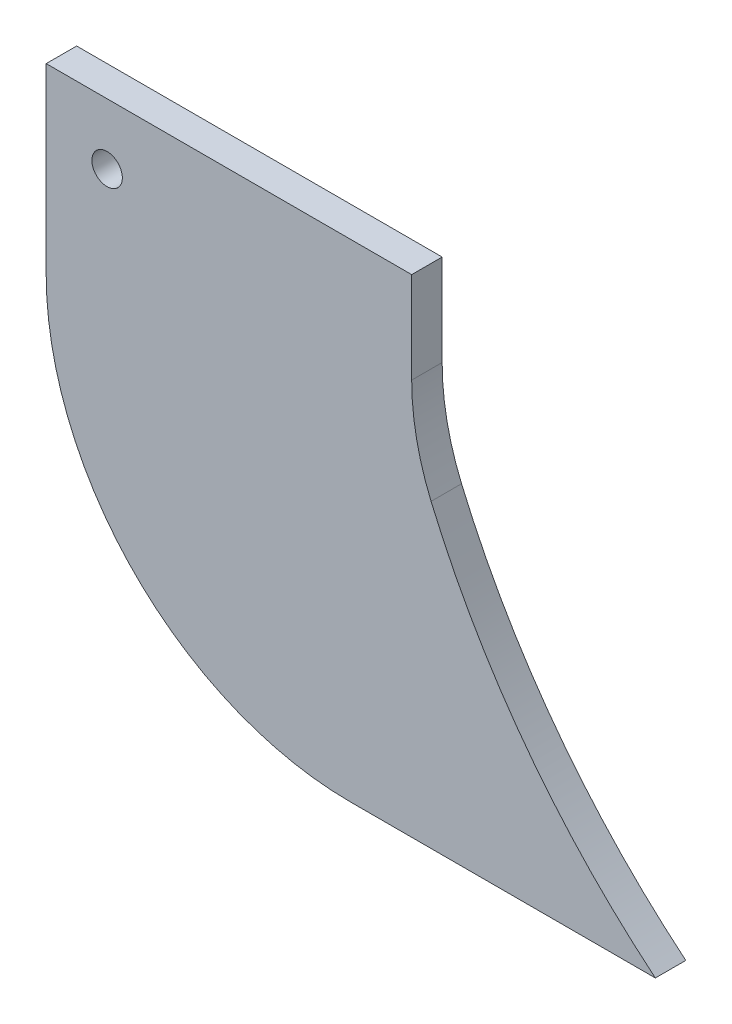
ISO-10303-21;
HEADER;
FILE_DESCRIPTION(('STEP AP214'),'2;1');
FILE_NAME('part.step','',(''),(''),'','','');
FILE_SCHEMA(('AUTOMOTIVE_DESIGN { 1 0 10303 214 1 1 1 1 }'));
ENDSEC;
DATA;
#1=APPLICATION_CONTEXT('core data for automotive mechanical design processes');
#2=APPLICATION_PROTOCOL_DEFINITION('international standard','automotive_design',2000,#1);
#3=PRODUCT_CONTEXT('',#1,'mechanical');
#4=PRODUCT('Part','Part','',(#3));
#5=PRODUCT_RELATED_PRODUCT_CATEGORY('part','',(#4));
#6=PRODUCT_DEFINITION_FORMATION('','',#4);
#7=PRODUCT_DEFINITION_CONTEXT('part definition',#1,'design');
#8=PRODUCT_DEFINITION('design','',#6,#7);
#9=PRODUCT_DEFINITION_SHAPE('','',#8);
#10=(LENGTH_UNIT() NAMED_UNIT(*) SI_UNIT(.MILLI.,.METRE.));
#11=(NAMED_UNIT(*) PLANE_ANGLE_UNIT() SI_UNIT($,.RADIAN.));
#12=(NAMED_UNIT(*) SI_UNIT($,.STERADIAN.) SOLID_ANGLE_UNIT());
#13=UNCERTAINTY_MEASURE_WITH_UNIT(LENGTH_MEASURE(1.E-05),#10,'distance_accuracy_value','');
#14=(GEOMETRIC_REPRESENTATION_CONTEXT(3) GLOBAL_UNCERTAINTY_ASSIGNED_CONTEXT((#13)) GLOBAL_UNIT_ASSIGNED_CONTEXT((#10,
#11,#12)) REPRESENTATION_CONTEXT('',''));
#15=CARTESIAN_POINT('',(0.,0.,0.));
#16=DIRECTION('',(0.,0.,1.));
#17=DIRECTION('',(1.,0.,0.));
#18=AXIS2_PLACEMENT_3D('',#15,#16,#17);
#19=CARTESIAN_POINT('',(232.199409389724,127.244230769231,6.35));
#20=DIRECTION('',(0.,0.,1.));
#21=DIRECTION('',(1.,0.,0.));
#22=AXIS2_PLACEMENT_3D('',#19,#20,#21);
#23=PLANE('',#22);
#24=CARTESIAN_POINT('',(232.199409389724,127.244230769231,6.35));
#25=DIRECTION('',(0.,0.,-1.));
#26=DIRECTION('',(1.,0.,0.));
#27=AXIS2_PLACEMENT_3D('',#24,#25,#26);
#28=CIRCLE('',#27,165.1);
#29=CARTESIAN_POINT('',(127.,0.,6.35));
#30=VERTEX_POINT('',#29);
#31=CARTESIAN_POINT('',(80.2447069379004,62.6858974358974,6.35));
#32=VERTEX_POINT('',#31);
#33=EDGE_CURVE('E155',#30,#32,#28,.T.);
#34=ORIENTED_EDGE('',*,*,#33,.T.);
#35=CARTESIAN_POINT('',(127.,82.55,6.35));
#36=DIRECTION('',(0.,0.,-1.));
#37=DIRECTION('',(1.,0.,0.));
#38=AXIS2_PLACEMENT_3D('',#35,#36,#37);
#39=CIRCLE('',#38,50.8);
#40=CARTESIAN_POINT('',(76.2,82.55,6.35));
#41=VERTEX_POINT('',#40);
#42=EDGE_CURVE('E97',#32,#41,#39,.T.);
#43=ORIENTED_EDGE('',*,*,#42,.T.);
#44=DIRECTION('',(0.,1.,0.));
#45=VECTOR('',#44,1.);
#46=CARTESIAN_POINT('',(76.2,101.6,6.35));
#47=LINE('',#46,#45);
#48=CARTESIAN_POINT('',(76.2,101.6,6.35));
#49=VERTEX_POINT('',#48);
#50=EDGE_CURVE('E172',#41,#49,#47,.T.);
#51=ORIENTED_EDGE('',*,*,#50,.T.);
#52=DIRECTION('',(-1.,0.,0.));
#53=VECTOR('',#52,1.);
#54=CARTESIAN_POINT('',(0.,101.6,6.35));
#55=LINE('',#54,#53);
#56=CARTESIAN_POINT('',(0.,101.6,6.35));
#57=VERTEX_POINT('',#56);
#58=EDGE_CURVE('E113',#49,#57,#55,.T.);
#59=ORIENTED_EDGE('',*,*,#58,.T.);
#60=DIRECTION('',(0.,-1.,0.));
#61=VECTOR('',#60,1.);
#62=CARTESIAN_POINT('',(0.,63.5000000000005,6.35));
#63=LINE('',#62,#61);
#64=CARTESIAN_POINT('',(0.,63.5,6.35));
#65=VERTEX_POINT('',#64);
#66=EDGE_CURVE('E107',#57,#65,#63,.T.);
#67=ORIENTED_EDGE('',*,*,#66,.T.);
#68=CARTESIAN_POINT('',(63.5,63.5,6.35));
#69=DIRECTION('',(0.,0.,1.));
#70=DIRECTION('',(-1.,0.,0.));
#71=AXIS2_PLACEMENT_3D('',#68,#69,#70);
#72=CIRCLE('',#71,63.5);
#73=CARTESIAN_POINT('',(63.5000000000005,0.,6.35));
#74=VERTEX_POINT('',#73);
#75=EDGE_CURVE('E111',#65,#74,#72,.T.);
#76=ORIENTED_EDGE('',*,*,#75,.T.);
#77=DIRECTION('',(1.,0.,0.));
#78=VECTOR('',#77,1.);
#79=CARTESIAN_POINT('',(63.5000000000005,0.,6.35));
#80=LINE('',#79,#78);
#81=EDGE_CURVE('E57',#74,#30,#80,.T.);
#82=ORIENTED_EDGE('',*,*,#81,.T.);
#83=EDGE_LOOP('',(#34,#43,#51,#59,#67,#76,#82));
#84=FACE_BOUND('',#83,.T.);
#85=CARTESIAN_POINT('',(12.7,88.9,6.35));
#86=DIRECTION('',(0.,0.,1.));
#87=DIRECTION('',(1.,0.,0.));
#88=AXIS2_PLACEMENT_3D('',#85,#86,#87);
#89=CIRCLE('',#88,3.175);
#90=CARTESIAN_POINT('',(15.875,88.9,6.35));
#91=VERTEX_POINT('',#90);
#92=EDGE_CURVE('E140',#91,#91,#89,.T.);
#93=ORIENTED_EDGE('',*,*,#92,.F.);
#94=EDGE_LOOP('',(#93));
#95=FACE_BOUND('',#94,.T.);
#96=ADVANCED_FACE('F39',(#84,#95),#23,.T.);
#97=CARTESIAN_POINT('',(232.199409389724,127.244230769231,0.));
#98=DIRECTION('',(0.,0.,1.));
#99=DIRECTION('',(1.,0.,0.));
#100=AXIS2_PLACEMENT_3D('',#97,#98,#99);
#101=PLANE('',#100);
#102=CARTESIAN_POINT('',(232.199409389724,127.244230769231,0.));
#103=DIRECTION('',(0.,0.,-1.));
#104=DIRECTION('',(1.,0.,0.));
#105=AXIS2_PLACEMENT_3D('',#102,#103,#104);
#106=CIRCLE('',#105,165.1);
#107=CARTESIAN_POINT('',(127.,0.,0.));
#108=VERTEX_POINT('',#107);
#109=CARTESIAN_POINT('',(80.2447069379004,62.6858974358974,0.));
#110=VERTEX_POINT('',#109);
#111=EDGE_CURVE('E135',#108,#110,#106,.T.);
#112=ORIENTED_EDGE('',*,*,#111,.F.);
#113=DIRECTION('',(1.,0.,0.));
#114=VECTOR('',#113,1.);
#115=CARTESIAN_POINT('',(63.5000000000005,0.,0.));
#116=LINE('',#115,#114);
#117=CARTESIAN_POINT('',(63.5000000000005,0.,0.));
#118=VERTEX_POINT('',#117);
#119=EDGE_CURVE('E89',#118,#108,#116,.T.);
#120=ORIENTED_EDGE('',*,*,#119,.F.);
#121=CARTESIAN_POINT('',(63.5,63.5,0.));
#122=DIRECTION('',(0.,0.,1.));
#123=DIRECTION('',(-1.,0.,0.));
#124=AXIS2_PLACEMENT_3D('',#121,#122,#123);
#125=CIRCLE('',#124,63.5);
#126=CARTESIAN_POINT('',(0.,63.5,0.));
#127=VERTEX_POINT('',#126);
#128=EDGE_CURVE('E83',#127,#118,#125,.T.);
#129=ORIENTED_EDGE('',*,*,#128,.F.);
#130=DIRECTION('',(0.,-1.,0.));
#131=VECTOR('',#130,1.);
#132=CARTESIAN_POINT('',(0.,63.5000000000005,0.));
#133=LINE('',#132,#131);
#134=CARTESIAN_POINT('',(0.,101.6,0.));
#135=VERTEX_POINT('',#134);
#136=EDGE_CURVE('E122',#135,#127,#133,.T.);
#137=ORIENTED_EDGE('',*,*,#136,.F.);
#138=DIRECTION('',(-1.,0.,0.));
#139=VECTOR('',#138,1.);
#140=CARTESIAN_POINT('',(0.,101.6,0.));
#141=LINE('',#140,#139);
#142=CARTESIAN_POINT('',(76.2,101.6,0.));
#143=VERTEX_POINT('',#142);
#144=EDGE_CURVE('E146',#143,#135,#141,.T.);
#145=ORIENTED_EDGE('',*,*,#144,.F.);
#146=DIRECTION('',(0.,1.,0.));
#147=VECTOR('',#146,1.);
#148=CARTESIAN_POINT('',(76.2,101.6,0.));
#149=LINE('',#148,#147);
#150=CARTESIAN_POINT('',(76.2,82.55,0.));
#151=VERTEX_POINT('',#150);
#152=EDGE_CURVE('E143',#151,#143,#149,.T.);
#153=ORIENTED_EDGE('',*,*,#152,.F.);
#154=CARTESIAN_POINT('',(127.,82.55,0.));
#155=DIRECTION('',(0.,0.,-1.));
#156=DIRECTION('',(1.,0.,0.));
#157=AXIS2_PLACEMENT_3D('',#154,#155,#156);
#158=CIRCLE('',#157,50.8);
#159=EDGE_CURVE('E139',#110,#151,#158,.T.);
#160=ORIENTED_EDGE('',*,*,#159,.F.);
#161=EDGE_LOOP('',(#112,#120,#129,#137,#145,#153,#160));
#162=FACE_BOUND('',#161,.T.);
#163=CARTESIAN_POINT('',(12.7,88.9,0.));
#164=DIRECTION('',(0.,0.,1.));
#165=DIRECTION('',(1.,0.,0.));
#166=AXIS2_PLACEMENT_3D('',#163,#164,#165);
#167=CIRCLE('',#166,3.175);
#168=CARTESIAN_POINT('',(15.875,88.9,0.));
#169=VERTEX_POINT('',#168);
#170=EDGE_CURVE('E188',#169,#169,#167,.T.);
#171=ORIENTED_EDGE('',*,*,#170,.T.);
#172=EDGE_LOOP('',(#171));
#173=FACE_BOUND('',#172,.T.);
#174=ADVANCED_FACE('F176',(#162,#173),#101,.F.);
#175=CARTESIAN_POINT('',(232.199409389724,127.244230769231,6.35));
#176=DIRECTION('',(0.,0.,-1.));
#177=DIRECTION('',(-1.,0.,0.));
#178=AXIS2_PLACEMENT_3D('',#175,#176,#177);
#179=CYLINDRICAL_SURFACE('',#178,165.1);
#180=ORIENTED_EDGE('',*,*,#111,.T.);
#181=DIRECTION('',(0.,0.,-1.));
#182=VECTOR('',#181,1.);
#183=CARTESIAN_POINT('',(80.2447069379004,62.6858974358974,6.35));
#184=LINE('',#183,#182);
#185=EDGE_CURVE('E11',#32,#110,#184,.T.);
#186=ORIENTED_EDGE('',*,*,#185,.F.);
#187=ORIENTED_EDGE('',*,*,#33,.F.);
#188=DIRECTION('',(0.,0.,-1.));
#189=VECTOR('',#188,1.);
#190=CARTESIAN_POINT('',(127.,0.,6.35));
#191=LINE('',#190,#189);
#192=EDGE_CURVE('E131',#30,#108,#191,.T.);
#193=ORIENTED_EDGE('',*,*,#192,.T.);
#194=EDGE_LOOP('',(#180,#186,#187,#193));
#195=FACE_BOUND('',#194,.T.);
#196=ADVANCED_FACE('F41',(#195),#179,.F.);
#197=CARTESIAN_POINT('',(127.,82.55,6.35));
#198=DIRECTION('',(0.,0.,-1.));
#199=DIRECTION('',(-1.,0.,0.));
#200=AXIS2_PLACEMENT_3D('',#197,#198,#199);
#201=CYLINDRICAL_SURFACE('',#200,50.8);
#202=ORIENTED_EDGE('',*,*,#159,.T.);
#203=DIRECTION('',(0.,0.,-1.));
#204=VECTOR('',#203,1.);
#205=CARTESIAN_POINT('',(76.2,82.55,6.35));
#206=LINE('',#205,#204);
#207=EDGE_CURVE('E49',#41,#151,#206,.T.);
#208=ORIENTED_EDGE('',*,*,#207,.F.);
#209=ORIENTED_EDGE('',*,*,#42,.F.);
#210=ORIENTED_EDGE('',*,*,#185,.T.);
#211=EDGE_LOOP('',(#202,#208,#209,#210));
#212=FACE_BOUND('',#211,.T.);
#213=ADVANCED_FACE('F216',(#212),#201,.F.);
#214=CARTESIAN_POINT('',(76.2,101.6,6.35));
#215=DIRECTION('',(-1.,0.,0.));
#216=DIRECTION('',(0.,0.,1.));
#217=AXIS2_PLACEMENT_3D('',#214,#215,#216);
#218=PLANE('',#217);
#219=ORIENTED_EDGE('',*,*,#152,.T.);
#220=DIRECTION('',(0.,0.,-1.));
#221=VECTOR('',#220,1.);
#222=CARTESIAN_POINT('',(76.2,101.6,6.35));
#223=LINE('',#222,#221);
#224=EDGE_CURVE('E162',#49,#143,#223,.T.);
#225=ORIENTED_EDGE('',*,*,#224,.F.);
#226=ORIENTED_EDGE('',*,*,#50,.F.);
#227=ORIENTED_EDGE('',*,*,#207,.T.);
#228=EDGE_LOOP('',(#219,#225,#226,#227));
#229=FACE_BOUND('',#228,.T.);
#230=ADVANCED_FACE('F170',(#229),#218,.F.);
#231=CARTESIAN_POINT('',(0.,101.6,6.35));
#232=DIRECTION('',(0.,-1.,0.));
#233=DIRECTION('',(0.,0.,-1.));
#234=AXIS2_PLACEMENT_3D('',#231,#232,#233);
#235=PLANE('',#234);
#236=ORIENTED_EDGE('',*,*,#144,.T.);
#237=DIRECTION('',(0.,0.,-1.));
#238=VECTOR('',#237,1.);
#239=CARTESIAN_POINT('',(0.,101.6,6.35));
#240=LINE('',#239,#238);
#241=EDGE_CURVE('E124',#57,#135,#240,.T.);
#242=ORIENTED_EDGE('',*,*,#241,.F.);
#243=ORIENTED_EDGE('',*,*,#58,.F.);
#244=ORIENTED_EDGE('',*,*,#224,.T.);
#245=EDGE_LOOP('',(#236,#242,#243,#244));
#246=FACE_BOUND('',#245,.T.);
#247=ADVANCED_FACE('F179',(#246),#235,.F.);
#248=CARTESIAN_POINT('',(0.,63.5000000000005,6.35));
#249=DIRECTION('',(1.,0.,0.));
#250=DIRECTION('',(0.,0.,-1.));
#251=AXIS2_PLACEMENT_3D('',#248,#249,#250);
#252=PLANE('',#251);
#253=ORIENTED_EDGE('',*,*,#136,.T.);
#254=DIRECTION('',(0.,0.,-1.));
#255=VECTOR('',#254,1.);
#256=CARTESIAN_POINT('',(0.,63.5,6.35));
#257=LINE('',#256,#255);
#258=EDGE_CURVE('E119',#65,#127,#257,.T.);
#259=ORIENTED_EDGE('',*,*,#258,.F.);
#260=ORIENTED_EDGE('',*,*,#66,.F.);
#261=ORIENTED_EDGE('',*,*,#241,.T.);
#262=EDGE_LOOP('',(#253,#259,#260,#261));
#263=FACE_BOUND('',#262,.T.);
#264=ADVANCED_FACE('F120',(#263),#252,.F.);
#265=CARTESIAN_POINT('',(63.5,63.5,6.35));
#266=DIRECTION('',(0.,0.,-1.));
#267=DIRECTION('',(-1.,0.,0.));
#268=AXIS2_PLACEMENT_3D('',#265,#266,#267);
#269=CYLINDRICAL_SURFACE('',#268,63.5);
#270=ORIENTED_EDGE('',*,*,#128,.T.);
#271=DIRECTION('',(0.,0.,-1.));
#272=VECTOR('',#271,1.);
#273=CARTESIAN_POINT('',(63.5000000000005,0.,6.35));
#274=LINE('',#273,#272);
#275=EDGE_CURVE('E125',#74,#118,#274,.T.);
#276=ORIENTED_EDGE('',*,*,#275,.F.);
#277=ORIENTED_EDGE('',*,*,#75,.F.);
#278=ORIENTED_EDGE('',*,*,#258,.T.);
#279=EDGE_LOOP('',(#270,#276,#277,#278));
#280=FACE_BOUND('',#279,.T.);
#281=ADVANCED_FACE('F127',(#280),#269,.T.);
#282=CARTESIAN_POINT('',(63.5000000000005,0.,6.35));
#283=DIRECTION('',(0.,1.,0.));
#284=DIRECTION('',(0.,0.,1.));
#285=AXIS2_PLACEMENT_3D('',#282,#283,#284);
#286=PLANE('',#285);
#287=ORIENTED_EDGE('',*,*,#119,.T.);
#288=ORIENTED_EDGE('',*,*,#192,.F.);
#289=ORIENTED_EDGE('',*,*,#81,.F.);
#290=ORIENTED_EDGE('',*,*,#275,.T.);
#291=EDGE_LOOP('',(#287,#288,#289,#290));
#292=FACE_BOUND('',#291,.T.);
#293=ADVANCED_FACE('F206',(#292),#286,.F.);
#294=CARTESIAN_POINT('',(12.7,88.9,6.35));
#295=DIRECTION('',(0.,0.,-1.));
#296=DIRECTION('',(-1.,0.,0.));
#297=AXIS2_PLACEMENT_3D('',#294,#295,#296);
#298=CYLINDRICAL_SURFACE('',#297,3.175);
#299=ORIENTED_EDGE('',*,*,#92,.T.);
#300=EDGE_LOOP('',(#299));
#301=FACE_BOUND('',#300,.T.);
#302=ORIENTED_EDGE('',*,*,#170,.F.);
#303=EDGE_LOOP('',(#302));
#304=FACE_BOUND('',#303,.T.);
#305=ADVANCED_FACE('F196',(#301,#304),#298,.F.);
#306=CLOSED_SHELL('',(#96,#174,#196,#213,#230,#247,#264,#281,#293,#305));
#307=MANIFOLD_SOLID_BREP('B2',#306);
#308=ADVANCED_BREP_SHAPE_REPRESENTATION('',(#18,#307),#14);
#309=SHAPE_DEFINITION_REPRESENTATION(#9,#308);
ENDSEC;
END-ISO-10303-21;
